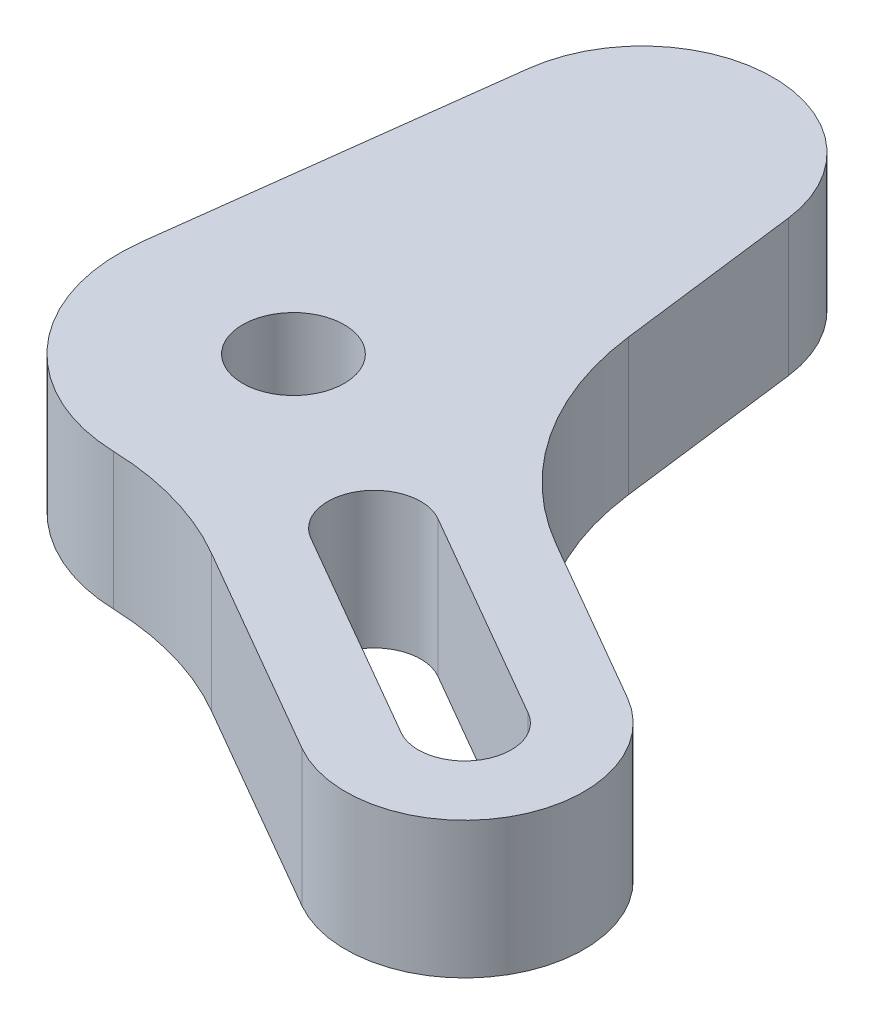
ISO-10303-21;
HEADER;
FILE_DESCRIPTION(('STEP AP214'),'2;1');
FILE_NAME('part.step','',(''),(''),'','','');
FILE_SCHEMA(('AUTOMOTIVE_DESIGN { 1 0 10303 214 1 1 1 1 }'));
ENDSEC;
DATA;
#1=APPLICATION_CONTEXT('core data for automotive mechanical design processes');
#2=APPLICATION_PROTOCOL_DEFINITION('international standard','automotive_design',2000,#1);
#3=PRODUCT_CONTEXT('',#1,'mechanical');
#4=PRODUCT('Part','Part','',(#3));
#5=PRODUCT_RELATED_PRODUCT_CATEGORY('part','',(#4));
#6=PRODUCT_DEFINITION_FORMATION('','',#4);
#7=PRODUCT_DEFINITION_CONTEXT('part definition',#1,'design');
#8=PRODUCT_DEFINITION('design','',#6,#7);
#9=PRODUCT_DEFINITION_SHAPE('','',#8);
#10=(LENGTH_UNIT() NAMED_UNIT(*) SI_UNIT(.MILLI.,.METRE.));
#11=(NAMED_UNIT(*) PLANE_ANGLE_UNIT() SI_UNIT($,.RADIAN.));
#12=(NAMED_UNIT(*) SI_UNIT($,.STERADIAN.) SOLID_ANGLE_UNIT());
#13=UNCERTAINTY_MEASURE_WITH_UNIT(LENGTH_MEASURE(1.E-05),#10,'distance_accuracy_value','');
#14=(GEOMETRIC_REPRESENTATION_CONTEXT(3) GLOBAL_UNCERTAINTY_ASSIGNED_CONTEXT((#13)) GLOBAL_UNIT_ASSIGNED_CONTEXT((#10,
#11,#12)) REPRESENTATION_CONTEXT('',''));
#15=CARTESIAN_POINT('',(0.,0.,0.));
#16=DIRECTION('',(0.,0.,1.));
#17=DIRECTION('',(1.,0.,0.));
#18=AXIS2_PLACEMENT_3D('',#15,#16,#17);
#19=CARTESIAN_POINT('',(0.,0.,-12.));
#20=DIRECTION('',(0.,1.,0.));
#21=DIRECTION('',(0.,0.,1.));
#22=AXIS2_PLACEMENT_3D('',#19,#20,#21);
#23=PLANE('',#22);
#24=CARTESIAN_POINT('',(0.,0.,0.));
#25=DIRECTION('',(0.,1.,0.));
#26=DIRECTION('',(0.,0.,1.));
#27=AXIS2_PLACEMENT_3D('',#24,#25,#26);
#28=CIRCLE('',#27,3.5);
#29=CARTESIAN_POINT('',(-3.47254859577228,0.,-0.4375));
#30=VERTEX_POINT('',#29);
#31=CARTESIAN_POINT('',(3.47254859577228,0.,-0.4375));
#32=VERTEX_POINT('',#31);
#33=EDGE_CURVE('E304',#30,#32,#28,.T.);
#34=ORIENTED_EDGE('',*,*,#33,.T.);
#35=DIRECTION('',(0.125,0.,0.992156741649222));
#36=VECTOR('',#35,1.);
#37=CARTESIAN_POINT('',(3.47254859577227,0.,-0.4375));
#38=LINE('',#37,#36);
#39=CARTESIAN_POINT('',(1.98431348329844,0.,-12.25));
#40=VERTEX_POINT('',#39);
#41=EDGE_CURVE('E291',#40,#32,#38,.T.);
#42=ORIENTED_EDGE('',*,*,#41,.F.);
#43=CARTESIAN_POINT('',(0.,0.,-12.));
#44=DIRECTION('',(0.,1.,0.));
#45=DIRECTION('',(0.,0.,1.));
#46=AXIS2_PLACEMENT_3D('',#43,#44,#45);
#47=CIRCLE('',#46,2.);
#48=CARTESIAN_POINT('',(-1.98431348329844,0.,-12.25));
#49=VERTEX_POINT('',#48);
#50=EDGE_CURVE('E287',#40,#49,#47,.T.);
#51=ORIENTED_EDGE('',*,*,#50,.T.);
#52=DIRECTION('',(-0.125,0.,0.992156741649222));
#53=VECTOR('',#52,1.);
#54=CARTESIAN_POINT('',(-3.47254859577228,0.,-0.4375));
#55=LINE('',#54,#53);
#56=EDGE_CURVE('E301',#49,#30,#55,.T.);
#57=ORIENTED_EDGE('',*,*,#56,.T.);
#58=EDGE_LOOP('',(#34,#42,#51,#57));
#59=FACE_BOUND('',#58,.T.);
#60=DIRECTION('',(0.125,0.,0.992156741649222));
#61=VECTOR('',#60,1.);
#62=CARTESIAN_POINT('',(5.95294044989533,0.,-0.749999999999999));
#63=LINE('',#62,#61);
#64=CARTESIAN_POINT('',(4.4647053374215,0.,-12.5625));
#65=VERTEX_POINT('',#64);
#66=CARTESIAN_POINT('',(5.25780550862459,0.,-6.26746254670157));
#67=VERTEX_POINT('',#66);
#68=EDGE_CURVE('E326',#65,#67,#63,.T.);
#69=ORIENTED_EDGE('',*,*,#68,.T.);
#70=CARTESIAN_POINT('',(15.1793729251168,0.,-7.51746254670157));
#71=DIRECTION('',(0.,1.,0.));
#72=DIRECTION('',(0.,0.,1.));
#73=AXIS2_PLACEMENT_3D('',#70,#71,#72);
#74=CIRCLE('',#73,10.);
#75=CARTESIAN_POINT('',(10.1793729251168,0.,1.14279149114283));
#76=VERTEX_POINT('',#75);
#77=EDGE_CURVE('E346',#67,#76,#74,.T.);
#78=ORIENTED_EDGE('',*,*,#77,.T.);
#79=DIRECTION('',(-0.86602540378444,0.,-0.499999999999998));
#80=VECTOR('',#79,1.);
#81=CARTESIAN_POINT('',(15.9930090009295,0.,4.49929584448375));
#82=LINE('',#81,#80);
#83=CARTESIAN_POINT('',(15.9930090009295,0.,4.49929584448375));
#84=VERTEX_POINT('',#83);
#85=EDGE_CURVE('E252',#84,#76,#82,.T.);
#86=ORIENTED_EDGE('',*,*,#85,.F.);
#87=CARTESIAN_POINT('',(13.9430090009295,0.,8.04999999999996));
#88=DIRECTION('',(0.,1.,0.));
#89=DIRECTION('',(1.,0.,0.));
#90=AXIS2_PLACEMENT_3D('',#87,#88,#89);
#91=CIRCLE('',#90,4.1);
#92=CARTESIAN_POINT('',(11.8930090009295,0.,11.6007041555162));
#93=VERTEX_POINT('',#92);
#94=EDGE_CURVE('E249',#93,#84,#91,.T.);
#95=ORIENTED_EDGE('',*,*,#94,.F.);
#96=DIRECTION('',(-0.86602540378444,0.,-0.499999999999998));
#97=VECTOR('',#96,1.);
#98=CARTESIAN_POINT('',(11.8930090009295,0.,11.6007041555162));
#99=LINE('',#98,#97);
#100=CARTESIAN_POINT('',(4.53179306876175,0.,7.35070415551619));
#101=VERTEX_POINT('',#100);
#102=EDGE_CURVE('E258',#93,#101,#99,.T.);
#103=ORIENTED_EDGE('',*,*,#102,.T.);
#104=CARTESIAN_POINT('',(6.58179306876174,0.,3.79999999999998));
#105=DIRECTION('',(0.,1.,0.));
#106=DIRECTION('',(1.,0.,0.));
#107=AXIS2_PLACEMENT_3D('',#104,#105,#106);
#108=CIRCLE('',#107,4.1);
#109=CARTESIAN_POINT('',(4.5223569568286,0.,7.34523947017202));
#110=VERTEX_POINT('',#109);
#111=EDGE_CURVE('E256',#110,#101,#108,.T.);
#112=ORIENTED_EDGE('',*,*,#111,.F.);
#113=CARTESIAN_POINT('',(-0.500657950325415,0.,15.992165007177));
#114=DIRECTION('',(0.,1.,0.));
#115=DIRECTION('',(0.,0.,1.));
#116=AXIS2_PLACEMENT_3D('',#113,#114,#115);
#117=CIRCLE('',#116,10.);
#118=CARTESIAN_POINT('',(-0.187746731372031,0.,5.99706187769137));
#119=VERTEX_POINT('',#118);
#120=EDGE_CURVE('E12',#110,#119,#117,.T.);
#121=ORIENTED_EDGE('',*,*,#120,.T.);
#122=CARTESIAN_POINT('',(0.,0.,0.));
#123=DIRECTION('',(0.,1.,0.));
#124=DIRECTION('',(1.,0.,0.));
#125=AXIS2_PLACEMENT_3D('',#122,#123,#124);
#126=CIRCLE('',#125,6.);
#127=CARTESIAN_POINT('',(-5.95294044989533,0.,-0.75));
#128=VERTEX_POINT('',#127);
#129=EDGE_CURVE('E323',#128,#119,#126,.T.);
#130=ORIENTED_EDGE('',*,*,#129,.F.);
#131=DIRECTION('',(-0.125,0.,0.992156741649222));
#132=VECTOR('',#131,1.);
#133=CARTESIAN_POINT('',(-5.95294044989533,0.,-0.75));
#134=LINE('',#133,#132);
#135=CARTESIAN_POINT('',(-4.4647053374215,0.,-12.5625));
#136=VERTEX_POINT('',#135);
#137=EDGE_CURVE('E321',#136,#128,#134,.T.);
#138=ORIENTED_EDGE('',*,*,#137,.F.);
#139=CARTESIAN_POINT('',(0.,0.,-12.));
#140=DIRECTION('',(0.,1.,0.));
#141=DIRECTION('',(1.,0.,0.));
#142=AXIS2_PLACEMENT_3D('',#139,#140,#141);
#143=CIRCLE('',#142,4.5);
#144=EDGE_CURVE('E318',#65,#136,#143,.T.);
#145=ORIENTED_EDGE('',*,*,#144,.F.);
#146=EDGE_LOOP('',(#69,#78,#86,#95,#103,#112,#121,#130,#138,#145));
#147=FACE_BOUND('',#146,.T.);
#148=DIRECTION('',(-0.86602540378444,0.,-0.499999999999997));
#149=VECTOR('',#148,1.);
#150=CARTESIAN_POINT('',(14.7430090009295,0.,6.66435935394485));
#151=LINE('',#150,#149);
#152=CARTESIAN_POINT('',(14.7430090009295,0.,6.66435935394485));
#153=VERTEX_POINT('',#152);
#154=CARTESIAN_POINT('',(7.38179306876174,0.,2.41435935394488));
#155=VERTEX_POINT('',#154);
#156=EDGE_CURVE('E220',#153,#155,#151,.T.);
#157=ORIENTED_EDGE('',*,*,#156,.T.);
#158=CARTESIAN_POINT('',(6.58179306876174,0.,3.79999999999998));
#159=DIRECTION('',(0.,1.,0.));
#160=DIRECTION('',(0.,0.,1.));
#161=AXIS2_PLACEMENT_3D('',#158,#159,#160);
#162=CIRCLE('',#161,1.6);
#163=CARTESIAN_POINT('',(5.78179306876175,0.,5.18564064605509));
#164=VERTEX_POINT('',#163);
#165=EDGE_CURVE('E224',#155,#164,#162,.T.);
#166=ORIENTED_EDGE('',*,*,#165,.T.);
#167=DIRECTION('',(-0.86602540378444,0.,-0.499999999999998));
#168=VECTOR('',#167,1.);
#169=CARTESIAN_POINT('',(13.1430090009295,0.,9.43564064605507));
#170=LINE('',#169,#168);
#171=CARTESIAN_POINT('',(13.1430090009295,0.,9.43564064605507));
#172=VERTEX_POINT('',#171);
#173=EDGE_CURVE('E216',#172,#164,#170,.T.);
#174=ORIENTED_EDGE('',*,*,#173,.F.);
#175=CARTESIAN_POINT('',(13.9430090009295,0.,8.04999999999996));
#176=DIRECTION('',(0.,1.,0.));
#177=DIRECTION('',(0.,0.,1.));
#178=AXIS2_PLACEMENT_3D('',#175,#176,#177);
#179=CIRCLE('',#178,1.6);
#180=EDGE_CURVE('E208',#172,#153,#179,.T.);
#181=ORIENTED_EDGE('',*,*,#180,.T.);
#182=EDGE_LOOP('',(#157,#166,#174,#181));
#183=FACE_BOUND('',#182,.T.);
#184=ADVANCED_FACE('F81',(#59,#147,#183),#23,.F.);
#185=CARTESIAN_POINT('',(0.,1.7,-12.));
#186=DIRECTION('',(0.,-1.,0.));
#187=DIRECTION('',(0.,0.,-1.));
#188=AXIS2_PLACEMENT_3D('',#185,#186,#187);
#189=CYLINDRICAL_SURFACE('',#188,4.5);
#190=ORIENTED_EDGE('',*,*,#144,.T.);
#191=DIRECTION('',(0.,-1.,0.));
#192=VECTOR('',#191,1.);
#193=CARTESIAN_POINT('',(-4.4647053374215,1.7,-12.5625));
#194=LINE('',#193,#192);
#195=CARTESIAN_POINT('',(-4.4647053374215,4.7,-12.5625));
#196=VERTEX_POINT('',#195);
#197=EDGE_CURVE('E334',#196,#136,#194,.T.);
#198=ORIENTED_EDGE('',*,*,#197,.F.);
#199=CARTESIAN_POINT('',(0.,4.7,-12.));
#200=DIRECTION('',(0.,1.,0.));
#201=DIRECTION('',(0.,0.,1.));
#202=AXIS2_PLACEMENT_3D('',#199,#200,#201);
#203=CIRCLE('',#202,4.5);
#204=CARTESIAN_POINT('',(4.4647053374215,4.7,-12.5625));
#205=VERTEX_POINT('',#204);
#206=EDGE_CURVE('E281',#205,#196,#203,.T.);
#207=ORIENTED_EDGE('',*,*,#206,.F.);
#208=DIRECTION('',(0.,-1.,0.));
#209=VECTOR('',#208,1.);
#210=CARTESIAN_POINT('',(4.4647053374215,1.7,-12.5625));
#211=LINE('',#210,#209);
#212=EDGE_CURVE('E329',#205,#65,#211,.T.);
#213=ORIENTED_EDGE('',*,*,#212,.T.);
#214=EDGE_LOOP('',(#190,#198,#207,#213));
#215=FACE_BOUND('',#214,.T.);
#216=ADVANCED_FACE('F388',(#215),#189,.T.);
#217=CARTESIAN_POINT('',(-5.95294044989533,1.7,-0.75));
#218=DIRECTION('',(0.992156741649222,0.,0.125));
#219=DIRECTION('',(0.125,0.,-0.992156741649222));
#220=AXIS2_PLACEMENT_3D('',#217,#218,#219);
#221=PLANE('',#220);
#222=ORIENTED_EDGE('',*,*,#137,.T.);
#223=DIRECTION('',(0.,-1.,0.));
#224=VECTOR('',#223,1.);
#225=CARTESIAN_POINT('',(-5.95294044989533,1.7,-0.75));
#226=LINE('',#225,#224);
#227=CARTESIAN_POINT('',(-5.95294044989533,4.7,-0.75));
#228=VERTEX_POINT('',#227);
#229=EDGE_CURVE('E331',#228,#128,#226,.T.);
#230=ORIENTED_EDGE('',*,*,#229,.F.);
#231=DIRECTION('',(-0.125,0.,0.992156741649221));
#232=VECTOR('',#231,1.);
#233=CARTESIAN_POINT('',(-4.4647053374215,4.7,-12.5625));
#234=LINE('',#233,#232);
#235=EDGE_CURVE('E284',#196,#228,#234,.T.);
#236=ORIENTED_EDGE('',*,*,#235,.F.);
#237=ORIENTED_EDGE('',*,*,#197,.T.);
#238=EDGE_LOOP('',(#222,#230,#236,#237));
#239=FACE_BOUND('',#238,.T.);
#240=ADVANCED_FACE('F386',(#239),#221,.F.);
#241=CARTESIAN_POINT('',(0.,1.7,0.));
#242=DIRECTION('',(0.,-1.,0.));
#243=DIRECTION('',(0.,0.,-1.));
#244=AXIS2_PLACEMENT_3D('',#241,#242,#243);
#245=CYLINDRICAL_SURFACE('',#244,6.);
#246=ORIENTED_EDGE('',*,*,#129,.T.);
#247=DIRECTION('',(0.,-1.,0.));
#248=VECTOR('',#247,1.);
#249=CARTESIAN_POINT('',(-0.187746731372031,1.7,5.99706187769137));
#250=LINE('',#249,#248);
#251=CARTESIAN_POINT('',(-0.187746731372031,4.7,5.99706187769137));
#252=VERTEX_POINT('',#251);
#253=EDGE_CURVE('E342',#119,#252,#250,.F.);
#254=ORIENTED_EDGE('',*,*,#253,.T.);
#255=CARTESIAN_POINT('',(0.,4.7,0.));
#256=DIRECTION('',(0.,1.,0.));
#257=DIRECTION('',(0.,0.,1.));
#258=AXIS2_PLACEMENT_3D('',#255,#256,#257);
#259=CIRCLE('',#258,6.);
#260=EDGE_CURVE('E273',#228,#252,#259,.T.);
#261=ORIENTED_EDGE('',*,*,#260,.F.);
#262=ORIENTED_EDGE('',*,*,#229,.T.);
#263=EDGE_LOOP('',(#246,#254,#261,#262));
#264=FACE_BOUND('',#263,.T.);
#265=ADVANCED_FACE('F382',(#264),#245,.T.);
#266=CARTESIAN_POINT('',(5.95294044989533,1.7,-0.749999999999999));
#267=DIRECTION('',(0.992156741649222,0.,-0.125));
#268=DIRECTION('',(-0.125,0.,-0.992156741649222));
#269=AXIS2_PLACEMENT_3D('',#266,#267,#268);
#270=PLANE('',#269);
#271=DIRECTION('',(-0.125,0.,-0.992156741649222));
#272=VECTOR('',#271,1.);
#273=CARTESIAN_POINT('',(4.4647053374215,4.7,-12.5625));
#274=LINE('',#273,#272);
#275=CARTESIAN_POINT('',(5.25780550862459,4.7,-6.26746254670157));
#276=VERTEX_POINT('',#275);
#277=EDGE_CURVE('E279',#276,#205,#274,.T.);
#278=ORIENTED_EDGE('',*,*,#277,.F.);
#279=DIRECTION('',(0.,-1.,0.));
#280=VECTOR('',#279,1.);
#281=CARTESIAN_POINT('',(5.25780550862459,0.,-6.26746254670157));
#282=LINE('',#281,#280);
#283=EDGE_CURVE('E337',#276,#67,#282,.T.);
#284=ORIENTED_EDGE('',*,*,#283,.T.);
#285=ORIENTED_EDGE('',*,*,#68,.F.);
#286=ORIENTED_EDGE('',*,*,#212,.F.);
#287=EDGE_LOOP('',(#278,#284,#285,#286));
#288=FACE_BOUND('',#287,.T.);
#289=ADVANCED_FACE('F358',(#288),#270,.T.);
#290=CARTESIAN_POINT('',(0.,1.7,-12.));
#291=DIRECTION('',(0.,-1.,0.));
#292=DIRECTION('',(0.,0.,-1.));
#293=AXIS2_PLACEMENT_3D('',#290,#291,#292);
#294=CYLINDRICAL_SURFACE('',#293,2.);
#295=ORIENTED_EDGE('',*,*,#50,.F.);
#296=DIRECTION('',(0.,-1.,0.));
#297=VECTOR('',#296,1.);
#298=CARTESIAN_POINT('',(1.98431348329844,1.7,-12.25));
#299=LINE('',#298,#297);
#300=CARTESIAN_POINT('',(1.98431348329844,1.7,-12.25));
#301=VERTEX_POINT('',#300);
#302=EDGE_CURVE('E298',#301,#40,#299,.T.);
#303=ORIENTED_EDGE('',*,*,#302,.F.);
#304=CARTESIAN_POINT('',(0.,1.7,-12.));
#305=DIRECTION('',(0.,1.,0.));
#306=DIRECTION('',(0.,0.,1.));
#307=AXIS2_PLACEMENT_3D('',#304,#305,#306);
#308=CIRCLE('',#307,2.);
#309=CARTESIAN_POINT('',(-1.98431348329844,1.7,-12.25));
#310=VERTEX_POINT('',#309);
#311=EDGE_CURVE('E288',#301,#310,#308,.T.);
#312=ORIENTED_EDGE('',*,*,#311,.T.);
#313=DIRECTION('',(0.,-1.,0.));
#314=VECTOR('',#313,1.);
#315=CARTESIAN_POINT('',(-1.98431348329844,1.7,-12.25));
#316=LINE('',#315,#314);
#317=EDGE_CURVE('E315',#310,#49,#316,.T.);
#318=ORIENTED_EDGE('',*,*,#317,.T.);
#319=EDGE_LOOP('',(#295,#303,#312,#318));
#320=FACE_BOUND('',#319,.T.);
#321=ADVANCED_FACE('F443',(#320),#294,.F.);
#322=CARTESIAN_POINT('',(-3.47254859577228,1.7,-0.4375));
#323=DIRECTION('',(0.992156741649222,0.,0.125));
#324=DIRECTION('',(0.125,0.,-0.992156741649222));
#325=AXIS2_PLACEMENT_3D('',#322,#323,#324);
#326=PLANE('',#325);
#327=ORIENTED_EDGE('',*,*,#56,.F.);
#328=ORIENTED_EDGE('',*,*,#317,.F.);
#329=DIRECTION('',(-0.125,0.,0.992156741649222));
#330=VECTOR('',#329,1.);
#331=CARTESIAN_POINT('',(-3.47254859577228,1.7,-0.4375));
#332=LINE('',#331,#330);
#333=CARTESIAN_POINT('',(-3.47254859577228,1.7,-0.4375));
#334=VERTEX_POINT('',#333);
#335=EDGE_CURVE('E290',#310,#334,#332,.T.);
#336=ORIENTED_EDGE('',*,*,#335,.T.);
#337=DIRECTION('',(0.,-1.,0.));
#338=VECTOR('',#337,1.);
#339=CARTESIAN_POINT('',(-3.47254859577228,1.7,-0.4375));
#340=LINE('',#339,#338);
#341=EDGE_CURVE('E313',#334,#30,#340,.T.);
#342=ORIENTED_EDGE('',*,*,#341,.T.);
#343=EDGE_LOOP('',(#327,#328,#336,#342));
#344=FACE_BOUND('',#343,.T.);
#345=ADVANCED_FACE('F439',(#344),#326,.T.);
#346=CARTESIAN_POINT('',(0.,1.7,0.));
#347=DIRECTION('',(0.,-1.,0.));
#348=DIRECTION('',(0.,0.,-1.));
#349=AXIS2_PLACEMENT_3D('',#346,#347,#348);
#350=CYLINDRICAL_SURFACE('',#349,3.5);
#351=CARTESIAN_POINT('',(0.,1.7,0.));
#352=DIRECTION('',(0.,1.,0.));
#353=DIRECTION('',(0.,0.,1.));
#354=AXIS2_PLACEMENT_3D('',#351,#352,#353);
#355=CIRCLE('',#354,3.5);
#356=CARTESIAN_POINT('',(3.47254859577227,1.7,-0.4375));
#357=VERTEX_POINT('',#356);
#358=EDGE_CURVE('E293',#334,#357,#355,.T.);
#359=ORIENTED_EDGE('',*,*,#358,.T.);
#360=DIRECTION('',(0.,-1.,0.));
#361=VECTOR('',#360,1.);
#362=CARTESIAN_POINT('',(3.47254859577228,1.7,-0.4375));
#363=LINE('',#362,#361);
#364=EDGE_CURVE('E310',#357,#32,#363,.T.);
#365=ORIENTED_EDGE('',*,*,#364,.T.);
#366=ORIENTED_EDGE('',*,*,#33,.F.);
#367=ORIENTED_EDGE('',*,*,#341,.F.);
#368=EDGE_LOOP('',(#359,#365,#366,#367));
#369=FACE_BOUND('',#368,.T.);
#370=ADVANCED_FACE('F435',(#369),#350,.F.);
#371=CARTESIAN_POINT('',(3.47254859577227,1.7,-0.4375));
#372=DIRECTION('',(0.992156741649222,0.,-0.125));
#373=DIRECTION('',(-0.125,0.,-0.992156741649222));
#374=AXIS2_PLACEMENT_3D('',#371,#372,#373);
#375=PLANE('',#374);
#376=ORIENTED_EDGE('',*,*,#41,.T.);
#377=ORIENTED_EDGE('',*,*,#364,.F.);
#378=DIRECTION('',(0.125,0.,0.992156741649222));
#379=VECTOR('',#378,1.);
#380=CARTESIAN_POINT('',(3.47254859577227,1.7,-0.4375));
#381=LINE('',#380,#379);
#382=EDGE_CURVE('E295',#301,#357,#381,.T.);
#383=ORIENTED_EDGE('',*,*,#382,.F.);
#384=ORIENTED_EDGE('',*,*,#302,.T.);
#385=EDGE_LOOP('',(#376,#377,#383,#384));
#386=FACE_BOUND('',#385,.T.);
#387=ADVANCED_FACE('F431',(#386),#375,.F.);
#388=CARTESIAN_POINT('',(0.,1.7,0.));
#389=DIRECTION('',(0.,1.,0.));
#390=DIRECTION('',(0.,0.,1.));
#391=AXIS2_PLACEMENT_3D('',#388,#389,#390);
#392=PLANE('',#391);
#393=CARTESIAN_POINT('',(0.,1.7,0.));
#394=DIRECTION('',(0.,1.,0.));
#395=DIRECTION('',(0.,0.,1.));
#396=AXIS2_PLACEMENT_3D('',#393,#394,#395);
#397=CIRCLE('',#396,1.75);
#398=CARTESIAN_POINT('',(0.,1.7,1.75));
#399=VERTEX_POINT('',#398);
#400=EDGE_CURVE('E233',#399,#399,#397,.T.);
#401=ORIENTED_EDGE('',*,*,#400,.T.);
#402=EDGE_LOOP('',(#401));
#403=FACE_BOUND('',#402,.T.);
#404=ORIENTED_EDGE('',*,*,#311,.F.);
#405=ORIENTED_EDGE('',*,*,#382,.T.);
#406=ORIENTED_EDGE('',*,*,#358,.F.);
#407=ORIENTED_EDGE('',*,*,#335,.F.);
#408=EDGE_LOOP('',(#404,#405,#406,#407));
#409=FACE_BOUND('',#408,.T.);
#410=ADVANCED_FACE('F427',(#403,#409),#392,.F.);
#411=CARTESIAN_POINT('',(0.,4.7,0.));
#412=DIRECTION('',(0.,1.,0.));
#413=DIRECTION('',(0.,0.,1.));
#414=AXIS2_PLACEMENT_3D('',#411,#412,#413);
#415=PLANE('',#414);
#416=CARTESIAN_POINT('',(0.,4.7,0.));
#417=DIRECTION('',(0.,1.,0.));
#418=DIRECTION('',(0.,0.,1.));
#419=AXIS2_PLACEMENT_3D('',#416,#417,#418);
#420=CIRCLE('',#419,1.75);
#421=CARTESIAN_POINT('',(0.,4.7,1.75));
#422=VERTEX_POINT('',#421);
#423=EDGE_CURVE('E611',#422,#422,#420,.T.);
#424=ORIENTED_EDGE('',*,*,#423,.F.);
#425=EDGE_LOOP('',(#424));
#426=FACE_BOUND('',#425,.T.);
#427=CARTESIAN_POINT('',(6.58179306876174,4.7,3.79999999999998));
#428=DIRECTION('',(0.,1.,0.));
#429=DIRECTION('',(0.,0.,1.));
#430=AXIS2_PLACEMENT_3D('',#427,#428,#429);
#431=CIRCLE('',#430,1.6);
#432=CARTESIAN_POINT('',(7.38179306876174,4.7,2.41435935394487));
#433=VERTEX_POINT('',#432);
#434=CARTESIAN_POINT('',(5.78179306876175,4.7,5.18564064605509));
#435=VERTEX_POINT('',#434);
#436=EDGE_CURVE('E230',#433,#435,#431,.T.);
#437=ORIENTED_EDGE('',*,*,#436,.F.);
#438=DIRECTION('',(-0.86602540378444,0.,-0.499999999999997));
#439=VECTOR('',#438,1.);
#440=CARTESIAN_POINT('',(14.7430090009295,4.7,6.66435935394485));
#441=LINE('',#440,#439);
#442=CARTESIAN_POINT('',(14.7430090009295,4.7,6.66435935394485));
#443=VERTEX_POINT('',#442);
#444=EDGE_CURVE('E239',#443,#433,#441,.T.);
#445=ORIENTED_EDGE('',*,*,#444,.F.);
#446=CARTESIAN_POINT('',(13.9430090009295,4.7,8.04999999999996));
#447=DIRECTION('',(0.,1.,0.));
#448=DIRECTION('',(0.,0.,1.));
#449=AXIS2_PLACEMENT_3D('',#446,#447,#448);
#450=CIRCLE('',#449,1.6);
#451=CARTESIAN_POINT('',(13.1430090009295,4.7,9.43564064605507));
#452=VERTEX_POINT('',#451);
#453=EDGE_CURVE('E211',#452,#443,#450,.T.);
#454=ORIENTED_EDGE('',*,*,#453,.F.);
#455=DIRECTION('',(-0.86602540378444,0.,-0.499999999999998));
#456=VECTOR('',#455,1.);
#457=CARTESIAN_POINT('',(13.1430090009295,4.7,9.43564064605507));
#458=LINE('',#457,#456);
#459=EDGE_CURVE('E227',#452,#435,#458,.T.);
#460=ORIENTED_EDGE('',*,*,#459,.T.);
#461=EDGE_LOOP('',(#437,#445,#454,#460));
#462=FACE_BOUND('',#461,.T.);
#463=ORIENTED_EDGE('',*,*,#260,.T.);
#464=CARTESIAN_POINT('',(-0.500657950325415,4.7,15.992165007177));
#465=DIRECTION('',(0.,1.,0.));
#466=DIRECTION('',(0.,0.,1.));
#467=AXIS2_PLACEMENT_3D('',#464,#465,#466);
#468=CIRCLE('',#467,10.);
#469=CARTESIAN_POINT('',(4.5223569568286,4.7,7.34523947017202));
#470=VERTEX_POINT('',#469);
#471=EDGE_CURVE('E89',#252,#470,#468,.F.);
#472=ORIENTED_EDGE('',*,*,#471,.T.);
#473=CARTESIAN_POINT('',(6.58179306876174,4.7,3.79999999999998));
#474=DIRECTION('',(0.,1.,0.));
#475=DIRECTION('',(1.,0.,0.));
#476=AXIS2_PLACEMENT_3D('',#473,#474,#475);
#477=CIRCLE('',#476,4.1);
#478=CARTESIAN_POINT('',(4.53179306876175,4.7,7.35070415551619));
#479=VERTEX_POINT('',#478);
#480=EDGE_CURVE('E267',#470,#479,#477,.T.);
#481=ORIENTED_EDGE('',*,*,#480,.T.);
#482=DIRECTION('',(-0.86602540378444,0.,-0.499999999999998));
#483=VECTOR('',#482,1.);
#484=CARTESIAN_POINT('',(11.8930090009295,4.7,11.6007041555162));
#485=LINE('',#484,#483);
#486=CARTESIAN_POINT('',(11.8930090009295,4.7,11.6007041555162));
#487=VERTEX_POINT('',#486);
#488=EDGE_CURVE('E253',#487,#479,#485,.T.);
#489=ORIENTED_EDGE('',*,*,#488,.F.);
#490=CARTESIAN_POINT('',(13.9430090009295,4.7,8.04999999999996));
#491=DIRECTION('',(0.,1.,0.));
#492=DIRECTION('',(1.,0.,0.));
#493=AXIS2_PLACEMENT_3D('',#490,#491,#492);
#494=CIRCLE('',#493,4.1);
#495=CARTESIAN_POINT('',(15.9930090009295,4.7,4.49929584448375));
#496=VERTEX_POINT('',#495);
#497=EDGE_CURVE('E244',#487,#496,#494,.T.);
#498=ORIENTED_EDGE('',*,*,#497,.T.);
#499=DIRECTION('',(-0.86602540378444,0.,-0.499999999999998));
#500=VECTOR('',#499,1.);
#501=CARTESIAN_POINT('',(15.9930090009295,4.7,4.49929584448375));
#502=LINE('',#501,#500);
#503=CARTESIAN_POINT('',(10.1793729251168,4.7,1.14279149114283));
#504=VERTEX_POINT('',#503);
#505=EDGE_CURVE('E264',#496,#504,#502,.T.);
#506=ORIENTED_EDGE('',*,*,#505,.T.);
#507=CARTESIAN_POINT('',(15.1793729251168,4.7,-7.51746254670157));
#508=DIRECTION('',(0.,1.,0.));
#509=DIRECTION('',(0.,0.,1.));
#510=AXIS2_PLACEMENT_3D('',#507,#508,#509);
#511=CIRCLE('',#510,10.);
#512=EDGE_CURVE('E348',#504,#276,#511,.F.);
#513=ORIENTED_EDGE('',*,*,#512,.T.);
#514=ORIENTED_EDGE('',*,*,#277,.T.);
#515=ORIENTED_EDGE('',*,*,#206,.T.);
#516=ORIENTED_EDGE('',*,*,#235,.T.);
#517=EDGE_LOOP('',(#463,#472,#481,#489,#498,#506,#513,#514,#515,#516));
#518=FACE_BOUND('',#517,.T.);
#519=ADVANCED_FACE('F351',(#426,#462,#518),#415,.T.);
#520=CARTESIAN_POINT('',(6.58179306876174,0.,3.79999999999998));
#521=DIRECTION('',(0.,1.,0.));
#522=DIRECTION('',(0.,0.,1.));
#523=AXIS2_PLACEMENT_3D('',#520,#521,#522);
#524=CYLINDRICAL_SURFACE('',#523,4.1);
#525=ORIENTED_EDGE('',*,*,#480,.F.);
#526=DIRECTION('',(0.,1.,0.));
#527=VECTOR('',#526,1.);
#528=CARTESIAN_POINT('',(4.5223569568286,0.,7.34523947017202));
#529=LINE('',#528,#527);
#530=EDGE_CURVE('E102',#470,#110,#529,.F.);
#531=ORIENTED_EDGE('',*,*,#530,.T.);
#532=ORIENTED_EDGE('',*,*,#111,.T.);
#533=DIRECTION('',(0.,1.,0.));
#534=VECTOR('',#533,1.);
#535=CARTESIAN_POINT('',(4.53179306876175,0.,7.35070415551619));
#536=LINE('',#535,#534);
#537=EDGE_CURVE('E274',#101,#479,#536,.T.);
#538=ORIENTED_EDGE('',*,*,#537,.T.);
#539=EDGE_LOOP('',(#525,#531,#532,#538));
#540=FACE_BOUND('',#539,.T.);
#541=ADVANCED_FACE('F377',(#540),#524,.T.);
#542=CARTESIAN_POINT('',(6.58179306876174,0.,3.79999999999998));
#543=DIRECTION('',(0.,1.,0.));
#544=DIRECTION('',(0.,0.,1.));
#545=AXIS2_PLACEMENT_3D('',#542,#543,#544);
#546=CYLINDRICAL_SURFACE('',#545,1.6);
#547=ORIENTED_EDGE('',*,*,#165,.F.);
#548=DIRECTION('',(0.,1.,0.));
#549=VECTOR('',#548,1.);
#550=CARTESIAN_POINT('',(7.38179306876174,0.,2.41435935394487));
#551=LINE('',#550,#549);
#552=EDGE_CURVE('E215',#155,#433,#551,.T.);
#553=ORIENTED_EDGE('',*,*,#552,.T.);
#554=ORIENTED_EDGE('',*,*,#436,.T.);
#555=DIRECTION('',(0.,1.,0.));
#556=VECTOR('',#555,1.);
#557=CARTESIAN_POINT('',(5.78179306876175,0.,5.18564064605509));
#558=LINE('',#557,#556);
#559=EDGE_CURVE('E245',#164,#435,#558,.T.);
#560=ORIENTED_EDGE('',*,*,#559,.F.);
#561=EDGE_LOOP('',(#547,#553,#554,#560));
#562=FACE_BOUND('',#561,.T.);
#563=ADVANCED_FACE('F414',(#562),#546,.F.);
#564=CARTESIAN_POINT('',(13.9430090009295,0.,8.04999999999996));
#565=DIRECTION('',(0.,1.,0.));
#566=DIRECTION('',(0.,0.,1.));
#567=AXIS2_PLACEMENT_3D('',#564,#565,#566);
#568=CYLINDRICAL_SURFACE('',#567,4.1);
#569=ORIENTED_EDGE('',*,*,#497,.F.);
#570=DIRECTION('',(0.,1.,0.));
#571=VECTOR('',#570,1.);
#572=CARTESIAN_POINT('',(11.8930090009295,0.,11.6007041555162));
#573=LINE('',#572,#571);
#574=EDGE_CURVE('E271',#93,#487,#573,.T.);
#575=ORIENTED_EDGE('',*,*,#574,.F.);
#576=ORIENTED_EDGE('',*,*,#94,.T.);
#577=DIRECTION('',(0.,1.,0.));
#578=VECTOR('',#577,1.);
#579=CARTESIAN_POINT('',(15.9930090009295,0.,4.49929584448375));
#580=LINE('',#579,#578);
#581=EDGE_CURVE('E261',#84,#496,#580,.T.);
#582=ORIENTED_EDGE('',*,*,#581,.T.);
#583=EDGE_LOOP('',(#569,#575,#576,#582));
#584=FACE_BOUND('',#583,.T.);
#585=ADVANCED_FACE('F370',(#584),#568,.T.);
#586=CARTESIAN_POINT('',(11.8930090009295,0.,11.6007041555162));
#587=DIRECTION('',(0.499999999999998,0.,-0.86602540378444));
#588=DIRECTION('',(-0.86602540378444,0.,-0.499999999999998));
#589=AXIS2_PLACEMENT_3D('',#586,#587,#588);
#590=PLANE('',#589);
#591=ORIENTED_EDGE('',*,*,#488,.T.);
#592=ORIENTED_EDGE('',*,*,#537,.F.);
#593=ORIENTED_EDGE('',*,*,#102,.F.);
#594=ORIENTED_EDGE('',*,*,#574,.T.);
#595=EDGE_LOOP('',(#591,#592,#593,#594));
#596=FACE_BOUND('',#595,.T.);
#597=ADVANCED_FACE('F375',(#596),#590,.F.);
#598=CARTESIAN_POINT('',(15.9930090009295,0.,4.49929584448375));
#599=DIRECTION('',(0.499999999999998,0.,-0.86602540378444));
#600=DIRECTION('',(-0.86602540378444,0.,-0.499999999999998));
#601=AXIS2_PLACEMENT_3D('',#598,#599,#600);
#602=PLANE('',#601);
#603=ORIENTED_EDGE('',*,*,#85,.T.);
#604=DIRECTION('',(0.,-1.,0.));
#605=VECTOR('',#604,1.);
#606=CARTESIAN_POINT('',(10.1793729251168,4.7,1.14279149114283));
#607=LINE('',#606,#605);
#608=EDGE_CURVE('E340',#76,#504,#607,.F.);
#609=ORIENTED_EDGE('',*,*,#608,.T.);
#610=ORIENTED_EDGE('',*,*,#505,.F.);
#611=ORIENTED_EDGE('',*,*,#581,.F.);
#612=EDGE_LOOP('',(#603,#609,#610,#611));
#613=FACE_BOUND('',#612,.T.);
#614=ADVANCED_FACE('F367',(#613),#602,.T.);
#615=CARTESIAN_POINT('',(13.9430090009295,0.,8.04999999999996));
#616=DIRECTION('',(0.,1.,0.));
#617=DIRECTION('',(0.,0.,1.));
#618=AXIS2_PLACEMENT_3D('',#615,#616,#617);
#619=CYLINDRICAL_SURFACE('',#618,1.6);
#620=ORIENTED_EDGE('',*,*,#453,.T.);
#621=DIRECTION('',(0.,1.,0.));
#622=VECTOR('',#621,1.);
#623=CARTESIAN_POINT('',(14.7430090009295,0.,6.66435935394485));
#624=LINE('',#623,#622);
#625=EDGE_CURVE('E204',#153,#443,#624,.T.);
#626=ORIENTED_EDGE('',*,*,#625,.F.);
#627=ORIENTED_EDGE('',*,*,#180,.F.);
#628=DIRECTION('',(0.,1.,0.));
#629=VECTOR('',#628,1.);
#630=CARTESIAN_POINT('',(13.1430090009295,0.,9.43564064605507));
#631=LINE('',#630,#629);
#632=EDGE_CURVE('E242',#172,#452,#631,.T.);
#633=ORIENTED_EDGE('',*,*,#632,.T.);
#634=EDGE_LOOP('',(#620,#626,#627,#633));
#635=FACE_BOUND('',#634,.T.);
#636=ADVANCED_FACE('F206',(#635),#619,.F.);
#637=CARTESIAN_POINT('',(13.1430090009295,0.,9.43564064605507));
#638=DIRECTION('',(0.499999999999998,0.,-0.86602540378444));
#639=DIRECTION('',(-0.86602540378444,0.,-0.499999999999998));
#640=AXIS2_PLACEMENT_3D('',#637,#638,#639);
#641=PLANE('',#640);
#642=ORIENTED_EDGE('',*,*,#459,.F.);
#643=ORIENTED_EDGE('',*,*,#632,.F.);
#644=ORIENTED_EDGE('',*,*,#173,.T.);
#645=ORIENTED_EDGE('',*,*,#559,.T.);
#646=EDGE_LOOP('',(#642,#643,#644,#645));
#647=FACE_BOUND('',#646,.T.);
#648=ADVANCED_FACE('F405',(#647),#641,.T.);
#649=CARTESIAN_POINT('',(14.7430090009295,0.,6.66435935394485));
#650=DIRECTION('',(0.499999999999997,0.,-0.86602540378444));
#651=DIRECTION('',(-0.86602540378444,0.,-0.499999999999997));
#652=AXIS2_PLACEMENT_3D('',#649,#650,#651);
#653=PLANE('',#652);
#654=ORIENTED_EDGE('',*,*,#444,.T.);
#655=ORIENTED_EDGE('',*,*,#552,.F.);
#656=ORIENTED_EDGE('',*,*,#156,.F.);
#657=ORIENTED_EDGE('',*,*,#625,.T.);
#658=EDGE_LOOP('',(#654,#655,#656,#657));
#659=FACE_BOUND('',#658,.T.);
#660=ADVANCED_FACE('F221',(#659),#653,.F.);
#661=CARTESIAN_POINT('',(15.1793729251168,1.7,-7.51746254670157));
#662=DIRECTION('',(0.,1.,0.));
#663=DIRECTION('',(0.,0.,1.));
#664=AXIS2_PLACEMENT_3D('',#661,#662,#663);
#665=CYLINDRICAL_SURFACE('',#664,10.);
#666=ORIENTED_EDGE('',*,*,#512,.F.);
#667=ORIENTED_EDGE('',*,*,#608,.F.);
#668=ORIENTED_EDGE('',*,*,#77,.F.);
#669=ORIENTED_EDGE('',*,*,#283,.F.);
#670=EDGE_LOOP('',(#666,#667,#668,#669));
#671=FACE_BOUND('',#670,.T.);
#672=ADVANCED_FACE('F361',(#671),#665,.F.);
#673=CARTESIAN_POINT('',(-0.500657950325415,0.,15.992165007177));
#674=DIRECTION('',(0.,-1.,0.));
#675=DIRECTION('',(0.,0.,-1.));
#676=AXIS2_PLACEMENT_3D('',#673,#674,#675);
#677=CYLINDRICAL_SURFACE('',#676,10.);
#678=ORIENTED_EDGE('',*,*,#120,.F.);
#679=ORIENTED_EDGE('',*,*,#530,.F.);
#680=ORIENTED_EDGE('',*,*,#471,.F.);
#681=ORIENTED_EDGE('',*,*,#253,.F.);
#682=EDGE_LOOP('',(#678,#679,#680,#681));
#683=FACE_BOUND('',#682,.T.);
#684=ADVANCED_FACE('F83',(#683),#677,.F.);
#685=CARTESIAN_POINT('',(0.,0.,0.));
#686=DIRECTION('',(0.,1.,0.));
#687=DIRECTION('',(0.,0.,1.));
#688=AXIS2_PLACEMENT_3D('',#685,#686,#687);
#689=CYLINDRICAL_SURFACE('',#688,1.75);
#690=ORIENTED_EDGE('',*,*,#423,.T.);
#691=EDGE_LOOP('',(#690));
#692=FACE_BOUND('',#691,.T.);
#693=ORIENTED_EDGE('',*,*,#400,.F.);
#694=EDGE_LOOP('',(#693));
#695=FACE_BOUND('',#694,.T.);
#696=ADVANCED_FACE('F404',(#692,#695),#689,.F.);
#697=CLOSED_SHELL('',(#184,#216,#240,#265,#289,#321,#345,#370,#387,#410,#519,#541,#563,#585,
#597,#614,#636,#648,#660,#672,#684,#696));
#698=MANIFOLD_SOLID_BREP('B2',#697);
#699=ADVANCED_BREP_SHAPE_REPRESENTATION('',(#18,#698),#14);
#700=SHAPE_DEFINITION_REPRESENTATION(#9,#699);
ENDSEC;
END-ISO-10303-21;
